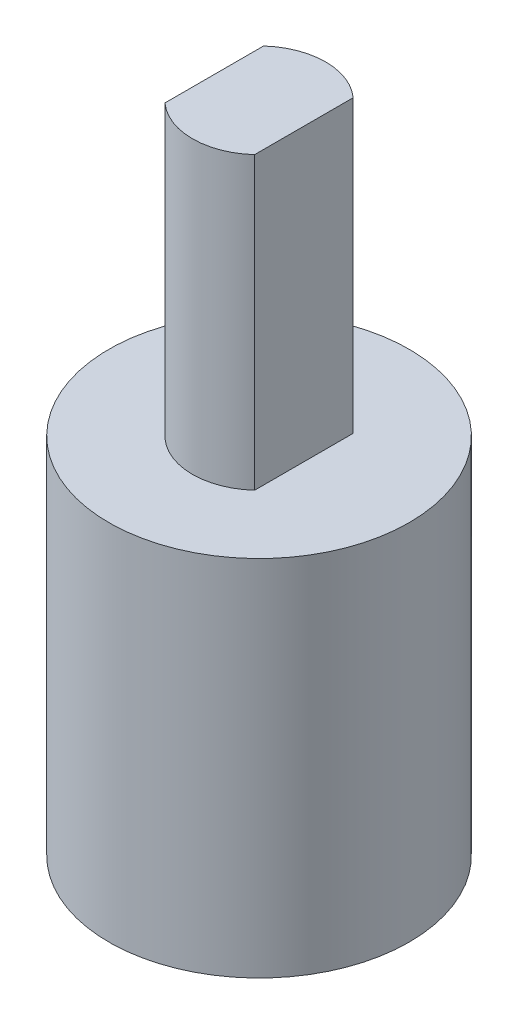
ISO-10303-21;
HEADER;
FILE_DESCRIPTION(('STEP AP214'),'2;1');
FILE_NAME('part.step','',(''),(''),'','','');
FILE_SCHEMA(('AUTOMOTIVE_DESIGN { 1 0 10303 214 1 1 1 1 }'));
ENDSEC;
DATA;
#1=APPLICATION_CONTEXT('core data for automotive mechanical design processes');
#2=APPLICATION_PROTOCOL_DEFINITION('international standard','automotive_design',2000,#1);
#3=PRODUCT_CONTEXT('',#1,'mechanical');
#4=PRODUCT('Part','Part','',(#3));
#5=PRODUCT_RELATED_PRODUCT_CATEGORY('part','',(#4));
#6=PRODUCT_DEFINITION_FORMATION('','',#4);
#7=PRODUCT_DEFINITION_CONTEXT('part definition',#1,'design');
#8=PRODUCT_DEFINITION('design','',#6,#7);
#9=PRODUCT_DEFINITION_SHAPE('','',#8);
#10=(LENGTH_UNIT() NAMED_UNIT(*) SI_UNIT(.MILLI.,.METRE.));
#11=(NAMED_UNIT(*) PLANE_ANGLE_UNIT() SI_UNIT($,.RADIAN.));
#12=(NAMED_UNIT(*) SI_UNIT($,.STERADIAN.) SOLID_ANGLE_UNIT());
#13=UNCERTAINTY_MEASURE_WITH_UNIT(LENGTH_MEASURE(1.E-05),#10,'distance_accuracy_value','');
#14=(GEOMETRIC_REPRESENTATION_CONTEXT(3) GLOBAL_UNCERTAINTY_ASSIGNED_CONTEXT((#13)) GLOBAL_UNIT_ASSIGNED_CONTEXT((#10,
#11,#12)) REPRESENTATION_CONTEXT('',''));
#15=CARTESIAN_POINT('',(0.,0.,0.));
#16=DIRECTION('',(0.,0.,1.));
#17=DIRECTION('',(1.,0.,0.));
#18=AXIS2_PLACEMENT_3D('',#15,#16,#17);
#19=CARTESIAN_POINT('',(5.92268052038709E-13,-169.632312064698,0.));
#20=DIRECTION('',(0.,-1.,0.));
#21=DIRECTION('',(1.,0.,0.));
#22=AXIS2_PLACEMENT_3D('',#19,#20,#21);
#23=CYLINDRICAL_SURFACE('',#22,2.75000000000007);
#24=CARTESIAN_POINT('',(0.,15.,0.));
#25=DIRECTION('',(0.,-1.,0.));
#26=DIRECTION('',(1.,0.,0.));
#27=AXIS2_PLACEMENT_3D('',#24,#25,#26);
#28=CIRCLE('',#27,2.75000000000005);
#29=CARTESIAN_POINT('',(1.84999999999995,15.,2.03469899493771));
#30=VERTEX_POINT('',#29);
#31=CARTESIAN_POINT('',(-1.85000000000005,15.,2.03469899493771));
#32=VERTEX_POINT('',#31);
#33=EDGE_CURVE('E98',#30,#32,#28,.T.);
#34=ORIENTED_EDGE('',*,*,#33,.F.);
#35=DIRECTION('',(0.,-1.,0.));
#36=VECTOR('',#35,1.);
#37=CARTESIAN_POINT('',(1.84999999999991,27.,2.03469899493771));
#38=LINE('',#37,#36);
#39=CARTESIAN_POINT('',(1.84999999999991,27.,2.03469899493771));
#40=VERTEX_POINT('',#39);
#41=EDGE_CURVE('E77',#40,#30,#38,.T.);
#42=ORIENTED_EDGE('',*,*,#41,.F.);
#43=CARTESIAN_POINT('',(0.,27.,0.));
#44=DIRECTION('',(0.,-1.,0.));
#45=DIRECTION('',(1.,0.,0.));
#46=AXIS2_PLACEMENT_3D('',#43,#44,#45);
#47=CIRCLE('',#46,2.75000000000009);
#48=CARTESIAN_POINT('',(-1.85000000000009,27.,2.03469899493771));
#49=VERTEX_POINT('',#48);
#50=EDGE_CURVE('E99',#40,#49,#47,.T.);
#51=ORIENTED_EDGE('',*,*,#50,.T.);
#52=DIRECTION('',(0.,-1.,0.));
#53=VECTOR('',#52,1.);
#54=CARTESIAN_POINT('',(-1.85000000000009,27.,2.03469899493771));
#55=LINE('',#54,#53);
#56=EDGE_CURVE('E58',#49,#32,#55,.T.);
#57=ORIENTED_EDGE('',*,*,#56,.T.);
#58=EDGE_LOOP('',(#34,#42,#51,#57));
#59=FACE_BOUND('',#58,.T.);
#60=ADVANCED_FACE('F35',(#59),#23,.T.);
#61=CARTESIAN_POINT('',(-1.85000000000009,27.,-2.03469899493771));
#62=VERTEX_POINT('',#61);
#63=CARTESIAN_POINT('',(1.84999999999991,27.,-2.03469899493771));
#64=VERTEX_POINT('',#63);
#65=EDGE_CURVE('E91',#62,#64,#47,.T.);
#66=ORIENTED_EDGE('',*,*,#65,.T.);
#67=DIRECTION('',(0.,-1.,0.));
#68=VECTOR('',#67,1.);
#69=CARTESIAN_POINT('',(1.84999999999991,27.,-2.03469899493771));
#70=LINE('',#69,#68);
#71=CARTESIAN_POINT('',(1.84999999999995,15.,-2.03469899493771));
#72=VERTEX_POINT('',#71);
#73=EDGE_CURVE('E50',#64,#72,#70,.T.);
#74=ORIENTED_EDGE('',*,*,#73,.T.);
#75=CARTESIAN_POINT('',(-1.85000000000005,15.,-2.03469899493771));
#76=VERTEX_POINT('',#75);
#77=EDGE_CURVE('E89',#76,#72,#28,.T.);
#78=ORIENTED_EDGE('',*,*,#77,.F.);
#79=DIRECTION('',(0.,-1.,0.));
#80=VECTOR('',#79,1.);
#81=CARTESIAN_POINT('',(-1.85000000000009,27.,-2.03469899493771));
#82=LINE('',#81,#80);
#83=EDGE_CURVE('E204',#62,#76,#82,.T.);
#84=ORIENTED_EDGE('',*,*,#83,.F.);
#85=EDGE_LOOP('',(#66,#74,#78,#84));
#86=FACE_BOUND('',#85,.T.);
#87=ADVANCED_FACE('F87',(#86),#23,.T.);
#88=CARTESIAN_POINT('',(0.,27.,0.));
#89=DIRECTION('',(0.,1.,0.));
#90=DIRECTION('',(-1.,0.,0.));
#91=AXIS2_PLACEMENT_3D('',#88,#89,#90);
#92=PLANE('',#91);
#93=ORIENTED_EDGE('',*,*,#50,.F.);
#94=DIRECTION('',(0.,0.,1.));
#95=VECTOR('',#94,1.);
#96=CARTESIAN_POINT('',(1.84999999999991,27.,-2.03469899493771));
#97=LINE('',#96,#95);
#98=EDGE_CURVE('E82',#64,#40,#97,.T.);
#99=ORIENTED_EDGE('',*,*,#98,.F.);
#100=ORIENTED_EDGE('',*,*,#65,.F.);
#101=DIRECTION('',(0.,0.,-1.));
#102=VECTOR('',#101,1.);
#103=CARTESIAN_POINT('',(-1.85000000000009,27.,-2.03469899493771));
#104=LINE('',#103,#102);
#105=EDGE_CURVE('E206',#49,#62,#104,.T.);
#106=ORIENTED_EDGE('',*,*,#105,.F.);
#107=EDGE_LOOP('',(#93,#99,#100,#106));
#108=FACE_BOUND('',#107,.T.);
#109=ADVANCED_FACE('F129',(#108),#92,.T.);
#110=CARTESIAN_POINT('',(5.92268052038709E-13,-169.632312064698,0.));
#111=DIRECTION('',(0.,-1.,0.));
#112=DIRECTION('',(1.,0.,0.));
#113=AXIS2_PLACEMENT_3D('',#110,#111,#112);
#114=CYLINDRICAL_SURFACE('',#113,3.20000000000002);
#115=CARTESIAN_POINT('',(0.,0.,0.));
#116=DIRECTION('',(0.,-1.,0.));
#117=DIRECTION('',(1.,0.,0.));
#118=AXIS2_PLACEMENT_3D('',#115,#116,#117);
#119=CIRCLE('',#118,3.2);
#120=CARTESIAN_POINT('',(3.2,0.,0.));
#121=VERTEX_POINT('',#120);
#122=EDGE_CURVE('E11',#121,#121,#119,.T.);
#123=ORIENTED_EDGE('',*,*,#122,.T.);
#124=EDGE_LOOP('',(#123));
#125=FACE_BOUND('',#124,.T.);
#126=CARTESIAN_POINT('',(0.,13.,0.));
#127=DIRECTION('',(0.,-1.,0.));
#128=DIRECTION('',(1.,0.,0.));
#129=AXIS2_PLACEMENT_3D('',#126,#127,#128);
#130=CIRCLE('',#129,3.20000000000005);
#131=CARTESIAN_POINT('',(3.2,13.,0.));
#132=VERTEX_POINT('',#131);
#133=EDGE_CURVE('E92',#132,#132,#130,.T.);
#134=ORIENTED_EDGE('',*,*,#133,.F.);
#135=EDGE_LOOP('',(#134));
#136=FACE_BOUND('',#135,.T.);
#137=ADVANCED_FACE('F37',(#125,#136),#114,.F.);
#138=CARTESIAN_POINT('',(3.2,0.,0.));
#139=DIRECTION('',(0.,-1.,0.));
#140=DIRECTION('',(1.,0.,0.));
#141=AXIS2_PLACEMENT_3D('',#138,#139,#140);
#142=PLANE('',#141);
#143=CARTESIAN_POINT('',(0.,0.,0.));
#144=DIRECTION('',(0.,-1.,0.));
#145=DIRECTION('',(1.,0.,0.));
#146=AXIS2_PLACEMENT_3D('',#143,#144,#145);
#147=CIRCLE('',#146,6.2);
#148=CARTESIAN_POINT('',(6.2,0.,0.));
#149=VERTEX_POINT('',#148);
#150=EDGE_CURVE('E43',#149,#149,#147,.T.);
#151=ORIENTED_EDGE('',*,*,#150,.T.);
#152=EDGE_LOOP('',(#151));
#153=FACE_BOUND('',#152,.T.);
#154=ORIENTED_EDGE('',*,*,#122,.F.);
#155=EDGE_LOOP('',(#154));
#156=FACE_BOUND('',#155,.T.);
#157=ADVANCED_FACE('F110',(#153,#156),#142,.T.);
#158=CARTESIAN_POINT('',(5.92268052038709E-13,-169.632312064698,0.));
#159=DIRECTION('',(0.,-1.,0.));
#160=DIRECTION('',(1.,0.,0.));
#161=AXIS2_PLACEMENT_3D('',#158,#159,#160);
#162=CYLINDRICAL_SURFACE('',#161,6.20000000000003);
#163=CARTESIAN_POINT('',(0.,15.,0.));
#164=DIRECTION('',(0.,-1.,0.));
#165=DIRECTION('',(1.,0.,0.));
#166=AXIS2_PLACEMENT_3D('',#163,#164,#165);
#167=CIRCLE('',#166,6.20000000000005);
#168=CARTESIAN_POINT('',(6.2,15.,0.));
#169=VERTEX_POINT('',#168);
#170=EDGE_CURVE('E101',#169,#169,#167,.T.);
#171=ORIENTED_EDGE('',*,*,#170,.T.);
#172=EDGE_LOOP('',(#171));
#173=FACE_BOUND('',#172,.T.);
#174=ORIENTED_EDGE('',*,*,#150,.F.);
#175=EDGE_LOOP('',(#174));
#176=FACE_BOUND('',#175,.T.);
#177=ADVANCED_FACE('F113',(#173,#176),#162,.T.);
#178=CARTESIAN_POINT('',(6.2,15.,0.));
#179=DIRECTION('',(0.,1.,0.));
#180=DIRECTION('',(-1.,0.,0.));
#181=AXIS2_PLACEMENT_3D('',#178,#179,#180);
#182=PLANE('',#181);
#183=ORIENTED_EDGE('',*,*,#33,.T.);
#184=DIRECTION('',(0.,0.,-1.));
#185=VECTOR('',#184,1.);
#186=CARTESIAN_POINT('',(-1.85000000000005,15.,-2.03469899493771));
#187=LINE('',#186,#185);
#188=EDGE_CURVE('E96',#32,#76,#187,.T.);
#189=ORIENTED_EDGE('',*,*,#188,.T.);
#190=ORIENTED_EDGE('',*,*,#77,.T.);
#191=DIRECTION('',(0.,0.,1.));
#192=VECTOR('',#191,1.);
#193=CARTESIAN_POINT('',(1.84999999999995,15.,-2.03469899493771));
#194=LINE('',#193,#192);
#195=EDGE_CURVE('E74',#72,#30,#194,.T.);
#196=ORIENTED_EDGE('',*,*,#195,.T.);
#197=EDGE_LOOP('',(#183,#189,#190,#196));
#198=FACE_BOUND('',#197,.T.);
#199=ORIENTED_EDGE('',*,*,#170,.F.);
#200=EDGE_LOOP('',(#199));
#201=FACE_BOUND('',#200,.T.);
#202=ADVANCED_FACE('F94',(#198,#201),#182,.T.);
#203=CARTESIAN_POINT('',(3.2,13.,0.));
#204=DIRECTION('',(0.,-1.,0.));
#205=DIRECTION('',(1.,0.,0.));
#206=AXIS2_PLACEMENT_3D('',#203,#204,#205);
#207=PLANE('',#206);
#208=ORIENTED_EDGE('',*,*,#133,.T.);
#209=EDGE_LOOP('',(#208));
#210=FACE_BOUND('',#209,.T.);
#211=ADVANCED_FACE('F121',(#210),#207,.T.);
#212=CARTESIAN_POINT('',(-1.85000000000009,27.,-2.03469899493771));
#213=DIRECTION('',(-1.,0.,0.));
#214=DIRECTION('',(0.,-1.,0.));
#215=AXIS2_PLACEMENT_3D('',#212,#213,#214);
#216=PLANE('',#215);
#217=ORIENTED_EDGE('',*,*,#188,.F.);
#218=ORIENTED_EDGE('',*,*,#56,.F.);
#219=ORIENTED_EDGE('',*,*,#105,.T.);
#220=ORIENTED_EDGE('',*,*,#83,.T.);
#221=EDGE_LOOP('',(#217,#218,#219,#220));
#222=FACE_BOUND('',#221,.T.);
#223=ADVANCED_FACE('F136',(#222),#216,.T.);
#224=CARTESIAN_POINT('',(1.84999999999991,27.,-2.03469899493771));
#225=DIRECTION('',(1.,0.,0.));
#226=DIRECTION('',(0.,1.,0.));
#227=AXIS2_PLACEMENT_3D('',#224,#225,#226);
#228=PLANE('',#227);
#229=ORIENTED_EDGE('',*,*,#195,.F.);
#230=ORIENTED_EDGE('',*,*,#73,.F.);
#231=ORIENTED_EDGE('',*,*,#98,.T.);
#232=ORIENTED_EDGE('',*,*,#41,.T.);
#233=EDGE_LOOP('',(#229,#230,#231,#232));
#234=FACE_BOUND('',#233,.T.);
#235=ADVANCED_FACE('F75',(#234),#228,.T.);
#236=CLOSED_SHELL('',(#60,#87,#109,#137,#157,#177,#202,#211,#223,#235));
#237=MANIFOLD_SOLID_BREP('B2',#236);
#238=ADVANCED_BREP_SHAPE_REPRESENTATION('',(#18,#237),#14);
#239=SHAPE_DEFINITION_REPRESENTATION(#9,#238);
ENDSEC;
END-ISO-10303-21;
